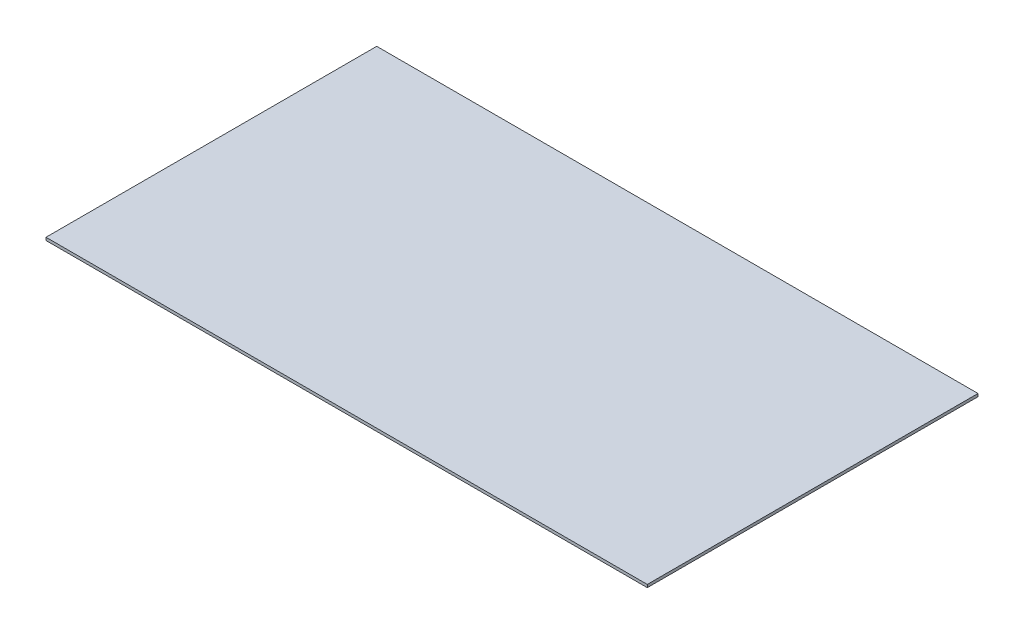
ISO-10303-21;
HEADER;
FILE_DESCRIPTION(('STEP AP214'),'2;1');
FILE_NAME('part.step','',(''),(''),'','','');
FILE_SCHEMA(('AUTOMOTIVE_DESIGN { 1 0 10303 214 1 1 1 1 }'));
ENDSEC;
DATA;
#1=APPLICATION_CONTEXT('core data for automotive mechanical design processes');
#2=APPLICATION_PROTOCOL_DEFINITION('international standard','automotive_design',2000,#1);
#3=PRODUCT_CONTEXT('',#1,'mechanical');
#4=PRODUCT('Part','Part','',(#3));
#5=PRODUCT_RELATED_PRODUCT_CATEGORY('part','',(#4));
#6=PRODUCT_DEFINITION_FORMATION('','',#4);
#7=PRODUCT_DEFINITION_CONTEXT('part definition',#1,'design');
#8=PRODUCT_DEFINITION('design','',#6,#7);
#9=PRODUCT_DEFINITION_SHAPE('','',#8);
#10=(LENGTH_UNIT() NAMED_UNIT(*) SI_UNIT(.MILLI.,.METRE.));
#11=(NAMED_UNIT(*) PLANE_ANGLE_UNIT() SI_UNIT($,.RADIAN.));
#12=(NAMED_UNIT(*) SI_UNIT($,.STERADIAN.) SOLID_ANGLE_UNIT());
#13=UNCERTAINTY_MEASURE_WITH_UNIT(LENGTH_MEASURE(1.E-05),#10,'distance_accuracy_value','');
#14=(GEOMETRIC_REPRESENTATION_CONTEXT(3) GLOBAL_UNCERTAINTY_ASSIGNED_CONTEXT((#13)) GLOBAL_UNIT_ASSIGNED_CONTEXT((#10,
#11,#12)) REPRESENTATION_CONTEXT('',''));
#15=CARTESIAN_POINT('',(0.,0.,0.));
#16=DIRECTION('',(0.,0.,1.));
#17=DIRECTION('',(1.,0.,0.));
#18=AXIS2_PLACEMENT_3D('',#15,#16,#17);
#19=CARTESIAN_POINT('',(1270.,12.,698.5));
#20=DIRECTION('',(0.,0.,-1.));
#21=DIRECTION('',(-1.,0.,0.));
#22=AXIS2_PLACEMENT_3D('',#19,#20,#21);
#23=PLANE('',#22);
#24=DIRECTION('',(1.,0.,0.));
#25=VECTOR('',#24,1.);
#26=CARTESIAN_POINT('',(1270.,0.,698.5));
#27=LINE('',#26,#25);
#28=CARTESIAN_POINT('',(-1270.,0.,698.5));
#29=VERTEX_POINT('',#28);
#30=CARTESIAN_POINT('',(1270.,0.,698.5));
#31=VERTEX_POINT('',#30);
#32=EDGE_CURVE('E107',#29,#31,#27,.T.);
#33=ORIENTED_EDGE('',*,*,#32,.T.);
#34=DIRECTION('',(0.,-1.,0.));
#35=VECTOR('',#34,1.);
#36=CARTESIAN_POINT('',(1270.,12.,698.5));
#37=LINE('',#36,#35);
#38=CARTESIAN_POINT('',(1270.,12.,698.5));
#39=VERTEX_POINT('',#38);
#40=EDGE_CURVE('E11',#39,#31,#37,.T.);
#41=ORIENTED_EDGE('',*,*,#40,.F.);
#42=DIRECTION('',(1.,0.,0.));
#43=VECTOR('',#42,1.);
#44=CARTESIAN_POINT('',(1270.,12.,698.5));
#45=LINE('',#44,#43);
#46=CARTESIAN_POINT('',(-1270.,12.,698.5));
#47=VERTEX_POINT('',#46);
#48=EDGE_CURVE('E91',#47,#39,#45,.T.);
#49=ORIENTED_EDGE('',*,*,#48,.F.);
#50=DIRECTION('',(0.,-1.,0.));
#51=VECTOR('',#50,1.);
#52=CARTESIAN_POINT('',(-1270.,12.,698.5));
#53=LINE('',#52,#51);
#54=EDGE_CURVE('E103',#47,#29,#53,.T.);
#55=ORIENTED_EDGE('',*,*,#54,.T.);
#56=EDGE_LOOP('',(#33,#41,#49,#55));
#57=FACE_BOUND('',#56,.T.);
#58=ADVANCED_FACE('F39',(#57),#23,.F.);
#59=CARTESIAN_POINT('',(1270.,12.,-698.5));
#60=DIRECTION('',(-1.,0.,0.));
#61=DIRECTION('',(0.,0.,1.));
#62=AXIS2_PLACEMENT_3D('',#59,#60,#61);
#63=PLANE('',#62);
#64=DIRECTION('',(0.,0.,-1.));
#65=VECTOR('',#64,1.);
#66=CARTESIAN_POINT('',(1270.,0.,-698.5));
#67=LINE('',#66,#65);
#68=CARTESIAN_POINT('',(1270.,0.,-698.5));
#69=VERTEX_POINT('',#68);
#70=EDGE_CURVE('E96',#31,#69,#67,.T.);
#71=ORIENTED_EDGE('',*,*,#70,.T.);
#72=DIRECTION('',(0.,-1.,0.));
#73=VECTOR('',#72,1.);
#74=CARTESIAN_POINT('',(1270.,12.,-698.5));
#75=LINE('',#74,#73);
#76=CARTESIAN_POINT('',(1270.,12.,-698.5));
#77=VERTEX_POINT('',#76);
#78=EDGE_CURVE('E48',#77,#69,#75,.T.);
#79=ORIENTED_EDGE('',*,*,#78,.F.);
#80=DIRECTION('',(0.,0.,-1.));
#81=VECTOR('',#80,1.);
#82=CARTESIAN_POINT('',(1270.,12.,-698.5));
#83=LINE('',#82,#81);
#84=EDGE_CURVE('E86',#39,#77,#83,.T.);
#85=ORIENTED_EDGE('',*,*,#84,.F.);
#86=ORIENTED_EDGE('',*,*,#40,.T.);
#87=EDGE_LOOP('',(#71,#79,#85,#86));
#88=FACE_BOUND('',#87,.T.);
#89=ADVANCED_FACE('F95',(#88),#63,.F.);
#90=CARTESIAN_POINT('',(-1270.,12.,-698.5));
#91=DIRECTION('',(0.,0.,1.));
#92=DIRECTION('',(1.,0.,0.));
#93=AXIS2_PLACEMENT_3D('',#90,#91,#92);
#94=PLANE('',#93);
#95=DIRECTION('',(-1.,0.,0.));
#96=VECTOR('',#95,1.);
#97=CARTESIAN_POINT('',(-1270.,0.,-698.5));
#98=LINE('',#97,#96);
#99=CARTESIAN_POINT('',(-1270.,0.,-698.5));
#100=VERTEX_POINT('',#99);
#101=EDGE_CURVE('E73',#69,#100,#98,.T.);
#102=ORIENTED_EDGE('',*,*,#101,.T.);
#103=DIRECTION('',(0.,-1.,0.));
#104=VECTOR('',#103,1.);
#105=CARTESIAN_POINT('',(-1270.,12.,-698.5));
#106=LINE('',#105,#104);
#107=CARTESIAN_POINT('',(-1270.,12.,-698.5));
#108=VERTEX_POINT('',#107);
#109=EDGE_CURVE('E98',#108,#100,#106,.T.);
#110=ORIENTED_EDGE('',*,*,#109,.F.);
#111=DIRECTION('',(-1.,0.,0.));
#112=VECTOR('',#111,1.);
#113=CARTESIAN_POINT('',(-1270.,12.,-698.5));
#114=LINE('',#113,#112);
#115=EDGE_CURVE('E89',#77,#108,#114,.T.);
#116=ORIENTED_EDGE('',*,*,#115,.F.);
#117=ORIENTED_EDGE('',*,*,#78,.T.);
#118=EDGE_LOOP('',(#102,#110,#116,#117));
#119=FACE_BOUND('',#118,.T.);
#120=ADVANCED_FACE('F99',(#119),#94,.F.);
#121=CARTESIAN_POINT('',(-1270.,12.,698.5));
#122=DIRECTION('',(1.,0.,0.));
#123=DIRECTION('',(0.,0.,-1.));
#124=AXIS2_PLACEMENT_3D('',#121,#122,#123);
#125=PLANE('',#124);
#126=DIRECTION('',(0.,0.,1.));
#127=VECTOR('',#126,1.);
#128=CARTESIAN_POINT('',(-1270.,0.,698.5));
#129=LINE('',#128,#127);
#130=EDGE_CURVE('E79',#100,#29,#129,.T.);
#131=ORIENTED_EDGE('',*,*,#130,.T.);
#132=ORIENTED_EDGE('',*,*,#54,.F.);
#133=DIRECTION('',(0.,0.,1.));
#134=VECTOR('',#133,1.);
#135=CARTESIAN_POINT('',(-1270.,12.,698.5));
#136=LINE('',#135,#134);
#137=EDGE_CURVE('E56',#108,#47,#136,.T.);
#138=ORIENTED_EDGE('',*,*,#137,.F.);
#139=ORIENTED_EDGE('',*,*,#109,.T.);
#140=EDGE_LOOP('',(#131,#132,#138,#139));
#141=FACE_BOUND('',#140,.T.);
#142=ADVANCED_FACE('F120',(#141),#125,.F.);
#143=CARTESIAN_POINT('',(0.,12.,0.));
#144=DIRECTION('',(0.,-1.,0.));
#145=DIRECTION('',(0.,0.,-1.));
#146=AXIS2_PLACEMENT_3D('',#143,#144,#145);
#147=PLANE('',#146);
#148=ORIENTED_EDGE('',*,*,#48,.T.);
#149=ORIENTED_EDGE('',*,*,#84,.T.);
#150=ORIENTED_EDGE('',*,*,#115,.T.);
#151=ORIENTED_EDGE('',*,*,#137,.T.);
#152=EDGE_LOOP('',(#148,#149,#150,#151));
#153=FACE_BOUND('',#152,.T.);
#154=ADVANCED_FACE('F87',(#153),#147,.F.);
#155=CARTESIAN_POINT('',(0.,0.,0.));
#156=DIRECTION('',(0.,-1.,0.));
#157=DIRECTION('',(0.,0.,-1.));
#158=AXIS2_PLACEMENT_3D('',#155,#156,#157);
#159=PLANE('',#158);
#160=ORIENTED_EDGE('',*,*,#32,.F.);
#161=ORIENTED_EDGE('',*,*,#130,.F.);
#162=ORIENTED_EDGE('',*,*,#101,.F.);
#163=ORIENTED_EDGE('',*,*,#70,.F.);
#164=EDGE_LOOP('',(#160,#161,#162,#163));
#165=FACE_BOUND('',#164,.T.);
#166=ADVANCED_FACE('F123',(#165),#159,.T.);
#167=CLOSED_SHELL('',(#58,#89,#120,#142,#154,#166));
#168=MANIFOLD_SOLID_BREP('B2',#167);
#169=ADVANCED_BREP_SHAPE_REPRESENTATION('',(#18,#168),#14);
#170=SHAPE_DEFINITION_REPRESENTATION(#9,#169);
ENDSEC;
END-ISO-10303-21;
